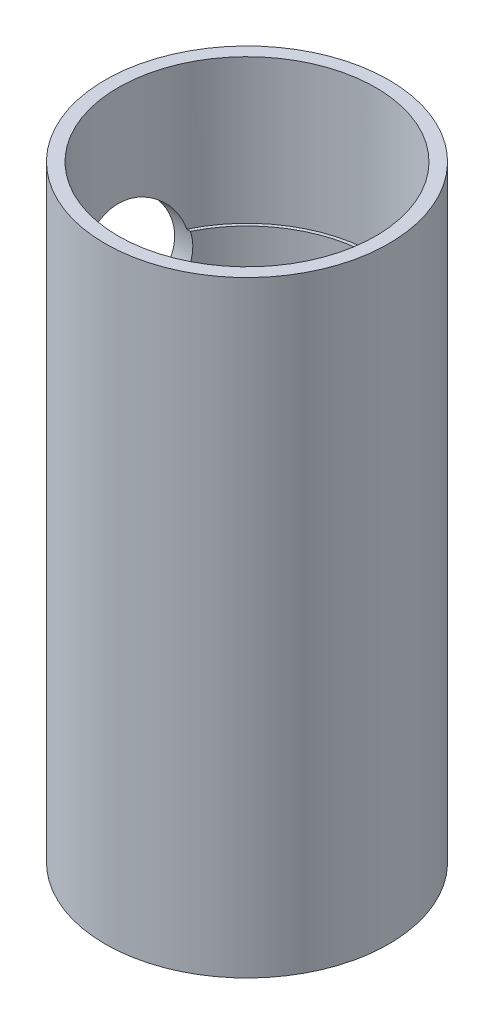
ISO-10303-21;
HEADER;
FILE_DESCRIPTION(('STEP AP214'),'2;1');
FILE_NAME('part.step','',(''),(''),'','','');
FILE_SCHEMA(('AUTOMOTIVE_DESIGN { 1 0 10303 214 1 1 1 1 }'));
ENDSEC;
DATA;
#1=APPLICATION_CONTEXT('core data for automotive mechanical design processes');
#2=APPLICATION_PROTOCOL_DEFINITION('international standard','automotive_design',2000,#1);
#3=PRODUCT_CONTEXT('',#1,'mechanical');
#4=PRODUCT('Part','Part','',(#3));
#5=PRODUCT_RELATED_PRODUCT_CATEGORY('part','',(#4));
#6=PRODUCT_DEFINITION_FORMATION('','',#4);
#7=PRODUCT_DEFINITION_CONTEXT('part definition',#1,'design');
#8=PRODUCT_DEFINITION('design','',#6,#7);
#9=PRODUCT_DEFINITION_SHAPE('','',#8);
#10=(LENGTH_UNIT() NAMED_UNIT(*) SI_UNIT(.MILLI.,.METRE.));
#11=(NAMED_UNIT(*) PLANE_ANGLE_UNIT() SI_UNIT($,.RADIAN.));
#12=(NAMED_UNIT(*) SI_UNIT($,.STERADIAN.) SOLID_ANGLE_UNIT());
#13=UNCERTAINTY_MEASURE_WITH_UNIT(LENGTH_MEASURE(1.E-05),#10,'distance_accuracy_value','');
#14=(GEOMETRIC_REPRESENTATION_CONTEXT(3) GLOBAL_UNCERTAINTY_ASSIGNED_CONTEXT((#13)) GLOBAL_UNIT_ASSIGNED_CONTEXT((#10,
#11,#12)) REPRESENTATION_CONTEXT('',''));
#15=CARTESIAN_POINT('',(0.,0.,0.));
#16=DIRECTION('',(0.,0.,1.));
#17=DIRECTION('',(1.,0.,0.));
#18=AXIS2_PLACEMENT_3D('',#15,#16,#17);
#19=CARTESIAN_POINT('',(0.,92.5,0.));
#20=DIRECTION('',(0.,-1.,0.));
#21=DIRECTION('',(0.,0.,-1.));
#22=AXIS2_PLACEMENT_3D('',#19,#20,#21);
#23=CYLINDRICAL_SURFACE('',#22,38.25);
#24=CARTESIAN_POINT('',(-34.2641941390718,48.5,17.0008088042893));
#25=CARTESIAN_POINT('',(-34.2381435848934,48.2849354779542,17.053307658475));
#26=CARTESIAN_POINT('',(-34.2139501900393,48.0686850927902,17.1017703815142));
#27=CARTESIAN_POINT('',(-34.1694481465527,47.6341120665675,17.1905149308626));
#28=CARTESIAN_POINT('',(-34.1491395748714,47.4157893845503,17.2307965951209));
#29=CARTESIAN_POINT('',(-34.0943033376247,46.7582367167698,17.3391939806238));
#30=CARTESIAN_POINT('',(-34.0658577161328,46.3163613613227,17.3948769432476));
#31=CARTESIAN_POINT('',(-34.0262278013022,45.4302944303113,17.4722693404018));
#32=CARTESIAN_POINT('',(-34.014990750002,44.9861141401189,17.4940826153484));
#33=CARTESIAN_POINT('',(-34.0099826794918,44.0973048101313,17.5038171775729));
#34=CARTESIAN_POINT('',(-34.016210190714,43.6526758112401,17.4917413164754));
#35=CARTESIAN_POINT('',(-34.0459345779966,42.765756573535,17.4338145053133));
#36=CARTESIAN_POINT('',(-34.0694491962198,42.3234692080585,17.3879288553609));
#37=CARTESIAN_POINT('',(-34.1329835449892,41.4448138791733,17.2628744296219));
#38=CARTESIAN_POINT('',(-34.1730042889734,41.0084462809243,17.1837036101966));
#39=CARTESIAN_POINT('',(-34.2682698028966,40.1445013582464,16.9929258414245));
#40=CARTESIAN_POINT('',(-34.3235170488628,39.7169254756272,16.8813136165217));
#41=CARTESIAN_POINT('',(-34.4475435978451,38.8732385977085,16.6267632834821));
#42=CARTESIAN_POINT('',(-34.5163230406553,38.4571277208988,16.4838248517285));
#43=CARTESIAN_POINT('',(-34.6667363889519,37.6315376158535,16.1651306656347));
#44=CARTESIAN_POINT('',(-34.7485727210965,37.2222989186612,15.9888482766277));
#45=CARTESIAN_POINT('',(-34.9219725410941,36.4199828887646,15.6064856014758));
#46=CARTESIAN_POINT('',(-35.0135392965897,36.0269110470224,15.4003952968805));
#47=CARTESIAN_POINT('',(-35.2040516835182,35.2587246783528,14.9597746127656));
#48=CARTESIAN_POINT('',(-35.3030001278675,34.8836170873327,14.7252333700046));
#49=CARTESIAN_POINT('',(-35.5058567589881,34.1531122381153,14.2291408484609));
#50=CARTESIAN_POINT('',(-35.6097652864978,33.7977163376698,13.9675877126269));
#51=CARTESIAN_POINT('',(-35.8311275063851,33.0722049803065,13.3902222747479));
#52=CARTESIAN_POINT('',(-35.9488648585861,32.7044111751399,13.0715960042441));
#53=CARTESIAN_POINT('',(-36.1843046752592,31.9967524573306,12.4049785893923));
#54=CARTESIAN_POINT('',(-36.3020071366213,31.6568773143975,12.0569982968926));
#55=CARTESIAN_POINT('',(-36.5344607320918,31.00658966723,11.3331480999331));
#56=CARTESIAN_POINT('',(-36.6492098810396,30.6961966217081,10.9572600634305));
#57=CARTESIAN_POINT('',(-36.8726927520938,30.1072056144364,10.179907041982));
#58=CARTESIAN_POINT('',(-36.9814288725541,29.8285949281678,9.77845239401758));
#59=CARTESIAN_POINT('',(-37.1938647235533,29.2956674646876,8.9372107724763));
#60=CARTESIAN_POINT('',(-37.2972460232827,29.042573234301,8.49656694811337));
#61=CARTESIAN_POINT('',(-37.4916875416269,28.5747212242354,7.59272813345202));
#62=CARTESIAN_POINT('',(-37.5827473129546,28.3599648361779,7.12953232531777));
#63=CARTESIAN_POINT('',(-37.7498444293093,27.9710781432407,6.18401797061164));
#64=CARTESIAN_POINT('',(-37.8258891329526,27.7969279303925,5.70170893094741));
#65=CARTESIAN_POINT('',(-37.9607035929183,27.4911335297655,4.72145580067361));
#66=CARTESIAN_POINT('',(-38.0194749640292,27.3594853685916,4.22351317638151));
#67=CARTESIAN_POINT('',(-38.1143676489956,27.1482341474891,3.25240313375543));
#68=CARTESIAN_POINT('',(-38.1518140468948,27.0655687515312,2.78002976803506));
#69=CARTESIAN_POINT('',(-38.2092129443408,26.9392378759796,1.82904354982571));
#70=CARTESIAN_POINT('',(-38.2291662712299,26.8955705519537,1.3504309935086));
#71=CARTESIAN_POINT('',(-38.2510106768318,26.8477782069746,0.39098625475133));
#72=CARTESIAN_POINT('',(-38.2529078172102,26.8436399156774,-0.0898451285645744));
#73=CARTESIAN_POINT('',(-38.2386008057896,26.8749237012639,-1.0499393157405));
#74=CARTESIAN_POINT('',(-38.2223972591985,26.910344455466,-1.52920217150788));
#75=CARTESIAN_POINT('',(-38.1739532384048,27.0167870428658,-2.45182127379952));
#76=CARTESIAN_POINT('',(-38.1428025818588,27.0853917843811,-2.89551656590489));
#77=CARTESIAN_POINT('',(-38.0658137103129,27.2561566037183,-3.77507582412566));
#78=CARTESIAN_POINT('',(-38.0199762702756,27.3583149110602,-4.21094020216573));
#79=CARTESIAN_POINT('',(-37.9147055894478,27.5951903216102,-5.07205990229719));
#80=CARTESIAN_POINT('',(-37.8552714777882,27.7299095103793,-5.49731454289734));
#81=CARTESIAN_POINT('',(-37.724187426682,28.0306823545084,-6.33465028591056));
#82=CARTESIAN_POINT('',(-37.65253701193,28.1967372290869,-6.74673087501375));
#83=CARTESIAN_POINT('',(-37.4963864340642,28.5640906181402,-7.56722906376009));
#84=CARTESIAN_POINT('',(-37.4115726593048,28.7662751614723,-7.97518997425803));
#85=CARTESIAN_POINT('',(-37.2326667858936,29.200803038743,-8.77257159703507));
#86=CARTESIAN_POINT('',(-37.1385745884722,29.4331466937363,-9.1619921118847));
#87=CARTESIAN_POINT('',(-36.9432040768317,29.9264386839699,-9.920462389794));
#88=CARTESIAN_POINT('',(-36.8419244682634,30.1873921760634,-10.2895084623263));
#89=CARTESIAN_POINT('',(-36.6343879472974,30.7363862271596,-11.0055969343031));
#90=CARTESIAN_POINT('',(-36.5281291107501,31.0244373016776,-11.3526307034381));
#91=CARTESIAN_POINT('',(-36.3038844379294,31.6514822562194,-12.0514007554351));
#92=CARTESIAN_POINT('',(-36.185667327808,31.9927243815419,-12.4010483415857));
#93=CARTESIAN_POINT('',(-35.9492358333471,32.7032290000104,-13.0706172093886));
#94=CARTESIAN_POINT('',(-35.8310214491907,33.0724923188239,-13.3905376144867));
#95=CARTESIAN_POINT('',(-35.5977296042384,33.8372236754821,-13.9989407114712));
#96=CARTESIAN_POINT('',(-35.4826531892806,34.2327003027419,-14.2874130159301));
#97=CARTESIAN_POINT('',(-35.2589048929774,35.047772414233,-14.8309997173997));
#98=CARTESIAN_POINT('',(-35.1502339838505,35.4673715407497,-15.0861090577515));
#99=CARTESIAN_POINT('',(-34.9393673629489,36.3417321055678,-15.5683824467248));
#100=CARTESIAN_POINT('',(-34.8374756303952,36.7971795166681,-15.7944389557166));
#101=CARTESIAN_POINT('',(-34.6475454313125,37.7282604543039,-16.2068398948384));
#102=CARTESIAN_POINT('',(-34.5595003893526,38.2038842625157,-16.3932031892248));
#103=CARTESIAN_POINT('',(-34.4005134627231,39.1720921357527,-16.7242618329952));
#104=CARTESIAN_POINT('',(-34.3295671598624,39.6646717818354,-16.8689679481781));
#105=CARTESIAN_POINT('',(-34.2076240679525,40.6629581013979,-17.1149020294832));
#106=CARTESIAN_POINT('',(-34.1566241234102,41.1686626850171,-17.2161368729638));
#107=CARTESIAN_POINT('',(-34.0801897971872,42.1448103002928,-17.3669123065925));
#108=CARTESIAN_POINT('',(-34.0529327501744,42.6145418657875,-17.4201523652447));
#109=CARTESIAN_POINT('',(-34.0179144579244,43.5575658098823,-17.4884391329691));
#110=CARTESIAN_POINT('',(-34.010154879679,44.0308584894805,-17.5034825763138));
#111=CARTESIAN_POINT('',(-34.0144311694162,44.9762367631149,-17.495170153445));
#112=CARTESIAN_POINT('',(-34.0264355124444,45.4483230788278,-17.4718754395241));
#113=CARTESIAN_POINT('',(-34.0697198385377,46.3879762786799,-17.3873217187934));
#114=CARTESIAN_POINT('',(-34.100988510702,46.8555456514072,-17.3260849892227));
#115=CARTESIAN_POINT('',(-34.1585584494719,47.5176350763709,-17.2121116657303));
#116=CARTESIAN_POINT('',(-34.1774908392059,47.7155312439865,-17.1745079542443));
#117=CARTESIAN_POINT('',(-34.2185092300184,48.1092723068575,-17.0926362884327));
#118=CARTESIAN_POINT('',(-34.2405900559208,48.3051200131082,-17.0483792639901));
#119=CARTESIAN_POINT('',(-34.2641941390718,48.5,-17.0008088042893));
#120=B_SPLINE_CURVE_WITH_KNOTS('',3,(#24,#25,#26,#27,#28,#29,#30,#31,#32,#33,#34,#35,#36,#37,
#38,#39,#40,#41,#42,#43,#44,#45,#46,#47,#48,#49,#50,#51,#52,#53,#54,#55,#56,#57,#58,#59,#60,#61,
#62,#63,#64,#65,#66,#67,#68,#69,#70,#71,#72,#73,#74,#75,#76,#77,#78,#79,#80,#81,#82,#83,#84,#85,
#86,#87,#88,#89,#90,#91,#92,#93,#94,#95,#96,#97,#98,#99,#100,#101,#102,#103,#104,#105,#106,#107,
#108,#109,#110,#111,#112,#113,#114,#115,#116,#117,#118,#119),.UNSPECIFIED.,.F.,.F.,(4,2,2,2,2,2,
2,2,2,2,2,2,2,2,2,2,2,2,2,2,2,2,2,2,2,2,2,2,2,2,2,2,2,2,2,2,2,2,2,2,2,2,2,2,2,2,2,4),(0.,
0.668624185006783,1.33726161285922,2.67434813861644,4.00732716524454,5.34019403079537,
6.67443076194051,8.00874942435118,9.34328519247991,10.6778347477381,12.0355522387374,
13.3937271240389,14.7524222346864,16.11121081706,17.6115088712097,19.1112546927625,
20.6119835934538,22.1121095314822,23.6657956600238,25.2195381742038,26.7725173265876,
28.3253512533266,29.7664959521713,31.207572487785,32.6481652206734,34.0887097878787,
35.4372914295982,36.7858019237924,38.1343988145036,39.483048187664,40.8709989422968,
42.2589644733725,43.6471805944283,45.0359376679571,46.5422543513417,48.0486154368329,
49.5554725811596,51.0625578483159,52.6162275358085,54.1691571838055,55.7216851347007,
57.2739673778463,58.692640322139,60.1114345557986,61.5279678967541,62.943670322774,
63.550528057953,64.1563995427988),.UNSPECIFIED.);
#121=CARTESIAN_POINT('',(-34.2641941390718,48.5,17.0008088042893));
#122=VERTEX_POINT('',#121);
#123=CARTESIAN_POINT('',(-34.2641941390718,48.5,-17.0008088042893));
#124=VERTEX_POINT('',#123);
#125=EDGE_CURVE('E54',#122,#124,#120,.T.);
#126=ORIENTED_EDGE('',*,*,#125,.F.);
#127=CARTESIAN_POINT('',(0.,48.5,0.));
#128=DIRECTION('',(0.,1.,0.));
#129=DIRECTION('',(0.,0.,1.));
#130=AXIS2_PLACEMENT_3D('',#127,#128,#129);
#131=CIRCLE('',#130,38.25);
#132=EDGE_CURVE('E85',#122,#124,#131,.T.);
#133=ORIENTED_EDGE('',*,*,#132,.T.);
#134=EDGE_LOOP('',(#126,#133));
#135=FACE_BOUND('',#134,.T.);
#136=CARTESIAN_POINT('',(0.,13.85,0.));
#137=DIRECTION('',(0.,-1.,0.));
#138=DIRECTION('',(0.,0.,-1.));
#139=AXIS2_PLACEMENT_3D('',#136,#137,#138);
#140=CIRCLE('',#139,38.25);
#141=CARTESIAN_POINT('',(0.,13.85,-38.25));
#142=VERTEX_POINT('',#141);
#143=EDGE_CURVE('E91',#142,#142,#140,.T.);
#144=ORIENTED_EDGE('',*,*,#143,.T.);
#145=EDGE_LOOP('',(#144));
#146=FACE_BOUND('',#145,.T.);
#147=ADVANCED_FACE('F39',(#135,#146),#23,.F.);
#148=CARTESIAN_POINT('',(0.,92.5,0.));
#149=DIRECTION('',(0.,1.,0.));
#150=DIRECTION('',(0.,0.,1.));
#151=AXIS2_PLACEMENT_3D('',#148,#149,#150);
#152=PLANE('',#151);
#153=CARTESIAN_POINT('',(0.,92.5,0.));
#154=DIRECTION('',(0.,1.,0.));
#155=DIRECTION('',(0.,0.,1.));
#156=AXIS2_PLACEMENT_3D('',#153,#154,#155);
#157=CIRCLE('',#156,39.25);
#158=CARTESIAN_POINT('',(0.,92.5,39.25));
#159=VERTEX_POINT('',#158);
#160=EDGE_CURVE('E79',#159,#159,#157,.T.);
#161=ORIENTED_EDGE('',*,*,#160,.F.);
#162=EDGE_LOOP('',(#161));
#163=FACE_BOUND('',#162,.T.);
#164=CARTESIAN_POINT('',(0.,92.5,0.));
#165=DIRECTION('',(0.,1.,0.));
#166=DIRECTION('',(0.,0.,1.));
#167=AXIS2_PLACEMENT_3D('',#164,#165,#166);
#168=CIRCLE('',#167,43.25);
#169=CARTESIAN_POINT('',(0.,92.5,43.25));
#170=VERTEX_POINT('',#169);
#171=EDGE_CURVE('E99',#170,#170,#168,.T.);
#172=ORIENTED_EDGE('',*,*,#171,.T.);
#173=EDGE_LOOP('',(#172));
#174=FACE_BOUND('',#173,.T.);
#175=ADVANCED_FACE('F118',(#163,#174),#152,.T.);
#176=CARTESIAN_POINT('',(0.,-92.5,0.));
#177=DIRECTION('',(0.,1.,0.));
#178=DIRECTION('',(0.,0.,1.));
#179=AXIS2_PLACEMENT_3D('',#176,#177,#178);
#180=PLANE('',#179);
#181=CARTESIAN_POINT('',(0.,-92.5,0.));
#182=DIRECTION('',(0.,1.,0.));
#183=DIRECTION('',(0.,0.,1.));
#184=AXIS2_PLACEMENT_3D('',#181,#182,#183);
#185=CIRCLE('',#184,43.25);
#186=CARTESIAN_POINT('',(0.,-92.5,43.25));
#187=VERTEX_POINT('',#186);
#188=EDGE_CURVE('E98',#187,#187,#185,.T.);
#189=ORIENTED_EDGE('',*,*,#188,.F.);
#190=EDGE_LOOP('',(#189));
#191=FACE_BOUND('',#190,.T.);
#192=CARTESIAN_POINT('',(0.,-92.5,0.));
#193=DIRECTION('',(0.,1.,0.));
#194=DIRECTION('',(0.,0.,1.));
#195=AXIS2_PLACEMENT_3D('',#192,#193,#194);
#196=CIRCLE('',#195,38.25);
#197=CARTESIAN_POINT('',(0.,-92.5,38.25));
#198=VERTEX_POINT('',#197);
#199=EDGE_CURVE('E95',#198,#198,#196,.T.);
#200=ORIENTED_EDGE('',*,*,#199,.T.);
#201=EDGE_LOOP('',(#200));
#202=FACE_BOUND('',#201,.T.);
#203=ADVANCED_FACE('F116',(#191,#202),#180,.F.);
#204=CARTESIAN_POINT('',(0.,92.5,0.));
#205=DIRECTION('',(0.,-1.,0.));
#206=DIRECTION('',(0.,0.,-1.));
#207=AXIS2_PLACEMENT_3D('',#204,#205,#206);
#208=CYLINDRICAL_SURFACE('',#207,43.25);
#209=CARTESIAN_POINT('',(-43.25,26.85,0.));
#210=CARTESIAN_POINT('',(-43.2499977648821,26.850002844216,-0.470059434277367));
#211=CARTESIAN_POINT('',(-43.242315552243,26.8689650815116,-0.940294062765784));
#212=CARTESIAN_POINT('',(-43.211778779537,26.9446417731731,-1.87743082592684));
#213=CARTESIAN_POINT('',(-43.1889142317585,27.0013810792808,-2.34433056223458));
#214=CARTESIAN_POINT('',(-43.1285451481035,27.1522183293541,-3.27227048018818));
#215=CARTESIAN_POINT('',(-43.0910054421133,27.24640603052,-3.73329381704013));
#216=CARTESIAN_POINT('',(-43.0022881934933,27.4711689672634,-4.64493934781961));
#217=CARTESIAN_POINT('',(-42.9511128541476,27.6017383243465,-5.09556320935262));
#218=CARTESIAN_POINT('',(-42.8366335919219,27.8975472167294,-5.98200699968892));
#219=CARTESIAN_POINT('',(-42.7733701371742,28.062671242022,-6.41787076643722));
#220=CARTESIAN_POINT('',(-42.6361865097981,28.4264242902271,-7.27364607323425));
#221=CARTESIAN_POINT('',(-42.5622659373908,28.6250545701019,-7.69355701410011));
#222=CARTESIAN_POINT('',(-42.4056182956549,29.0541241803067,-8.51473250296929));
#223=CARTESIAN_POINT('',(-42.3228965934096,29.28454414988,-8.91600820300398));
#224=CARTESIAN_POINT('',(-42.1505457868008,29.7757448603038,-9.69816737601018));
#225=CARTESIAN_POINT('',(-42.0609139936476,30.0365374398211,-10.0790428123304));
#226=CARTESIAN_POINT('',(-41.8728593952449,30.5987437432511,-10.8343968901387));
#227=CARTESIAN_POINT('',(-41.7742237278819,30.9014320696689,-11.2078742027632));
#228=CARTESIAN_POINT('',(-41.5742488793874,31.536087355285,-11.9282904328624));
#229=CARTESIAN_POINT('',(-41.4729096040497,31.8680553356549,-12.2752284239501));
#230=CARTESIAN_POINT('',(-41.2700801175748,32.5594839715228,-12.9407913246801));
#231=CARTESIAN_POINT('',(-41.1685898622032,32.9189556000249,-13.2594048230751));
#232=CARTESIAN_POINT('',(-40.9681385478603,33.6633556892427,-13.8663734349416));
#233=CARTESIAN_POINT('',(-40.8691778925874,34.0482881785177,-14.1547237412418));
#234=CARTESIAN_POINT('',(-40.6720426858552,34.8597699571218,-14.7118577265007));
#235=CARTESIAN_POINT('',(-40.5741141137364,35.2874193633521,-14.9791292444083));
#236=CARTESIAN_POINT('',(-40.3870626977385,36.1654895559165,-15.4763768145114));
#237=CARTESIAN_POINT('',(-40.2979362310091,36.6159008573367,-15.7063682359944));
#238=CARTESIAN_POINT('',(-40.1313921632747,37.5366984820836,-16.1271539384876));
#239=CARTESIAN_POINT('',(-40.0539727271687,38.0070816599415,-16.3179543644506));
#240=CARTESIAN_POINT('',(-39.9135461941763,38.9645730845136,-16.6584905254094));
#241=CARTESIAN_POINT('',(-39.85053809301,39.4516801630702,-16.8082291220181));
#242=CARTESIAN_POINT('',(-39.7437927605097,40.4161051724473,-17.05904913232));
#243=CARTESIAN_POINT('',(-39.6993009203272,40.8928388462224,-17.1620557454882));
#244=CARTESIAN_POINT('',(-39.627140145584,41.8544935024117,-17.328026130822));
#245=CARTESIAN_POINT('',(-39.5994707170832,42.3394142440074,-17.3909910786943));
#246=CARTESIAN_POINT('',(-39.5619841425426,43.3133024504649,-17.4761003471459));
#247=CARTESIAN_POINT('',(-39.5521592079475,43.8022680562117,-17.4982624769182));
#248=CARTESIAN_POINT('',(-39.550709122454,44.7803520513256,-17.5015406934382));
#249=CARTESIAN_POINT('',(-39.5590830936164,45.2694704321846,-17.4826587602059));
#250=CARTESIAN_POINT('',(-39.5924666556732,46.2088429713542,-17.4069126294781));
#251=CARTESIAN_POINT('',(-39.616241887769,46.6593717558863,-17.3528654886494));
#252=CARTESIAN_POINT('',(-39.678434872842,47.5538634614433,-17.2101817936726));
#253=CARTESIAN_POINT('',(-39.7168518193313,47.9978267427071,-17.1215471446506));
#254=CARTESIAN_POINT('',(-39.8071474899506,48.8763072272052,-16.9105484982901));
#255=CARTESIAN_POINT('',(-39.8590279445647,49.310823208378,-16.7881801649869));
#256=CARTESIAN_POINT('',(-39.9747128613793,50.167681839503,-16.5108262606456));
#257=CARTESIAN_POINT('',(-40.0385177674413,50.5900240356373,-16.3558394754305));
#258=CARTESIAN_POINT('',(-40.1776757417442,51.4286761037803,-16.0110002279462));
#259=CARTESIAN_POINT('',(-40.2532396700456,51.8446823687218,-15.8204951618841));
#260=CARTESIAN_POINT('',(-40.4128218147288,52.6592245996199,-15.4082820241698));
#261=CARTESIAN_POINT('',(-40.4968400696483,53.0577604859284,-15.1865738102807));
#262=CARTESIAN_POINT('',(-40.6711533374526,53.8354567600271,-14.7133734515888));
#263=CARTESIAN_POINT('',(-40.7614502571728,54.21461120046,-14.4618722421681));
#264=CARTESIAN_POINT('',(-40.9460462107693,54.9515799217684,-13.9306447464836));
#265=CARTESIAN_POINT('',(-41.0403454563368,55.3093930714467,-13.6509169661793));
#266=CARTESIAN_POINT('',(-41.2382629032203,56.02951364981,-13.0414265505587));
#267=CARTESIAN_POINT('',(-41.3420256165126,56.3899136734192,-12.7094537521764));
#268=CARTESIAN_POINT('',(-41.5487311593366,57.0815933228605,-12.016492967026));
#269=CARTESIAN_POINT('',(-41.6516742955086,57.4128843550012,-11.6555164524246));
#270=CARTESIAN_POINT('',(-41.8540982974705,58.0446203183379,-10.9063084669352));
#271=CARTESIAN_POINT('',(-41.9535776316081,58.3450517154518,-10.5180651622934));
#272=CARTESIAN_POINT('',(-42.1463937721416,58.9128752070573,-9.71667748219642));
#273=CARTESIAN_POINT('',(-42.2397306070256,59.1802674547862,-9.30353322224621));
#274=CARTESIAN_POINT('',(-42.4196180657154,59.6851985955382,-8.44596708696947));
#275=CARTESIAN_POINT('',(-42.5059878411286,59.9220034894991,-8.00107428827261));
#276=CARTESIAN_POINT('',(-42.6672815337763,60.3570372814059,-7.09078391371716));
#277=CARTESIAN_POINT('',(-42.7422051840391,60.5552652796069,-6.62538585991634));
#278=CARTESIAN_POINT('',(-42.8783924764108,60.9111312833959,-5.67759167941601));
#279=CARTESIAN_POINT('',(-42.9396618574823,61.0687863463359,-5.19520279315624));
#280=CARTESIAN_POINT('',(-43.0467397188671,61.3419130834324,-4.21695657454257));
#281=CARTESIAN_POINT('',(-43.0925492978836,61.4573877553292,-3.72110020200849));
#282=CARTESIAN_POINT('',(-43.1650481182577,61.6391693672073,-2.75020559605458));
#283=CARTESIAN_POINT('',(-43.1927242964743,61.7080226662511,-2.27571658022923));
#284=CARTESIAN_POINT('',(-43.2324232768283,61.8065738855666,-1.32204201876229));
#285=CARTESIAN_POINT('',(-43.2444467080269,61.8362733793736,-0.842856662639644));
#286=CARTESIAN_POINT('',(-43.2525023411747,61.8561857342567,0.116354639928129));
#287=CARTESIAN_POINT('',(-43.2485382470592,61.8464077413418,0.596380365922489));
#288=CARTESIAN_POINT('',(-43.2247382862753,61.7874949093837,1.55360698058765));
#289=CARTESIAN_POINT('',(-43.2049027368322,61.7383608569562,2.03080792552574));
#290=CARTESIAN_POINT('',(-43.1511908786069,61.6044582525519,2.95673378052892));
#291=CARTESIAN_POINT('',(-43.118007041868,61.5214445609101,3.40575429504912));
#292=CARTESIAN_POINT('',(-43.0385434003731,61.3209218495559,4.2948181443191));
#293=CARTESIAN_POINT('',(-42.9922641023187,61.2034141645105,4.73486182570271));
#294=CARTESIAN_POINT('',(-42.8877377037914,60.9349576580756,5.6031887580431));
#295=CARTESIAN_POINT('',(-42.8294896795458,60.7840062553564,6.03147109833955));
#296=CARTESIAN_POINT('',(-42.7024178840039,60.4499331227533,6.87367471807431));
#297=CARTESIAN_POINT('',(-42.6335937380661,60.266810253216,7.28759548814101));
#298=CARTESIAN_POINT('',(-42.4847181864237,59.8637013041062,8.11120757133793));
#299=CARTESIAN_POINT('',(-42.4043868747247,59.6427557671346,8.52037852079318));
#300=CARTESIAN_POINT('',(-42.2361292412104,59.1698158329657,9.3187086651997));
#301=CARTESIAN_POINT('',(-42.148202815797,58.9178210122328,9.70786758706921));
#302=CARTESIAN_POINT('',(-41.9668230084931,58.3844091352346,10.4642029711473));
#303=CARTESIAN_POINT('',(-41.8733686332185,58.1029867837612,10.8313754583454));
#304=CARTESIAN_POINT('',(-41.6831115687275,57.5123505490372,11.5419259587758));
#305=CARTESIAN_POINT('',(-41.5863076915489,57.2031267420319,11.885295397412));
#306=CARTESIAN_POINT('',(-41.3850974807288,56.5369312254383,12.5686708075017));
#307=CARTESIAN_POINT('',(-41.2806185295181,56.1781460020152,12.9068899517914));
#308=CARTESIAN_POINT('',(-41.073325245266,55.4330315158436,13.5520961351205));
#309=CARTESIAN_POINT('',(-40.9705110141142,55.0467005749155,13.8590812685067));
#310=CARTESIAN_POINT('',(-40.7694070429601,54.2485465391662,14.4399610535917));
#311=CARTESIAN_POINT('',(-40.6711190897773,53.8367135248977,14.7138427053217));
#312=CARTESIAN_POINT('',(-40.4820456971393,52.9902320251574,15.2263283875827));
#313=CARTESIAN_POINT('',(-40.3912572575834,52.5555927779774,15.4649465553332));
#314=CARTESIAN_POINT('',(-40.2190041915652,51.6609878143109,15.9075853310841));
#315=CARTESIAN_POINT('',(-40.1376551394433,51.2007932934099,16.1111893612872));
#316=CARTESIAN_POINT('',(-39.9882194615447,50.2626615901637,16.4785976805825));
#317=CARTESIAN_POINT('',(-39.9201330310867,49.7847241466418,16.6424013835439));
#318=CARTESIAN_POINT('',(-39.7997082344541,48.8149269365687,16.9283732359771));
#319=CARTESIAN_POINT('',(-39.7473598526283,48.3230762433826,17.0505678719415));
#320=CARTESIAN_POINT('',(-39.6603421243688,47.3291272372655,17.2520102640288));
#321=CARTESIAN_POINT('',(-39.6256712486793,46.8270298146743,17.3312617351412));
#322=CARTESIAN_POINT('',(-39.577215905536,45.8540117934851,17.4416112219965));
#323=CARTESIAN_POINT('',(-39.5620849711273,45.3835084238347,17.475817182458));
#324=CARTESIAN_POINT('',(-39.5486894074129,44.4410460469657,17.5061121131864));
#325=CARTESIAN_POINT('',(-39.5504239169474,43.9690871152992,17.5022030296309));
#326=CARTESIAN_POINT('',(-39.5706969814816,43.0274539859396,17.4563185034596));
#327=CARTESIAN_POINT('',(-39.5892334693502,42.5577795143379,17.4143477435348));
#328=CARTESIAN_POINT('',(-39.6424648284504,41.6242546690589,17.2928270893453));
#329=CARTESIAN_POINT('',(-39.6771596111532,41.1604042634868,17.2132774009697));
#330=CARTESIAN_POINT('',(-39.7597804030315,40.2610112499345,17.0215379900631));
#331=CARTESIAN_POINT('',(-39.8070973271153,39.8250928841698,16.9108404084966));
#332=CARTESIAN_POINT('',(-39.9140832510825,38.9644766117882,16.65675359561));
#333=CARTESIAN_POINT('',(-39.9737518001177,38.5397782962648,16.5133655575087));
#334=CARTESIAN_POINT('',(-40.1037522229892,37.704032465471,16.1950943522642));
#335=CARTESIAN_POINT('',(-40.1740846169956,37.2929856172964,16.0202096486718));
#336=CARTESIAN_POINT('',(-40.3235447841811,36.4866142793651,15.6402019215587));
#337=CARTESIAN_POINT('',(-40.4026757526318,36.0912955726383,15.4350679038814));
#338=CARTESIAN_POINT('',(-40.5724797337683,35.2960996129921,14.9832551308622));
#339=CARTESIAN_POINT('',(-40.6635557748369,34.897284097535,14.7348584529602));
#340=CARTESIAN_POINT('',(-40.8508124733559,34.1217039644758,14.207459510504));
#341=CARTESIAN_POINT('',(-40.9469932982221,33.7449400709286,13.92845624186));
#342=CARTESIAN_POINT('',(-41.1420170461912,33.0152418045547,13.3413875548945));
#343=CARTESIAN_POINT('',(-41.2408610872391,32.6623176640744,13.033309791695));
#344=CARTESIAN_POINT('',(-41.4386748481155,31.9824196584947,12.389993249649));
#345=CARTESIAN_POINT('',(-41.5376445214441,31.6554380539841,12.0547626320578));
#346=CARTESIAN_POINT('',(-41.7399147344887,31.0080053623813,11.3353786570621));
#347=CARTESIAN_POINT('',(-41.8430588332582,30.689472782613,10.9494513062316));
#348=CARTESIAN_POINT('',(-42.0439434678828,30.0860011681566,10.1508056809915));
#349=CARTESIAN_POINT('',(-42.1416836810896,29.8010641382014,9.73808581007938));
#350=CARTESIAN_POINT('',(-42.3291039645086,29.2667917404913,8.8881332058247));
#351=CARTESIAN_POINT('',(-42.4187796894837,29.0174755235444,8.45088746124001));
#352=CARTESIAN_POINT('',(-42.5874802506419,28.5567436990427,7.55491682978529));
#353=CARTESIAN_POINT('',(-42.6665059739542,28.3453249342024,7.09619373624043));
#354=CARTESIAN_POINT('',(-42.8103192210252,27.9658242773945,6.16888932226306));
#355=CARTESIAN_POINT('',(-42.8753387708321,27.7970266103111,5.70063719331077));
#356=CARTESIAN_POINT('',(-42.9910694239837,27.4995296108421,4.74971895872984));
#357=CARTESIAN_POINT('',(-43.0417780744381,27.370837152102,4.26705039778131));
#358=CARTESIAN_POINT('',(-43.1272572015762,27.1553038258687,3.29253697619321));
#359=CARTESIAN_POINT('',(-43.1620725400378,27.068345121127,2.80072207409971));
#360=CARTESIAN_POINT('',(-43.2149135081823,26.9367889948241,1.81081580923629));
#361=CARTESIAN_POINT('',(-43.2329517425886,26.8921597704104,1.31272944388051));
#362=CARTESIAN_POINT('',(-43.2448956552269,26.8626187897994,0.678186142356621));
#363=CARTESIAN_POINT('',(-43.2468089024352,26.8578878531542,0.542603421824419));
#364=CARTESIAN_POINT('',(-43.2493613975927,26.8515780473008,0.271351999916106));
#365=CARTESIAN_POINT('',(-43.2500006451698,26.8499991790132,0.135683298514894));
#366=CARTESIAN_POINT('',(-43.25,26.85,0.));
#367=B_SPLINE_CURVE_WITH_KNOTS('',3,(#209,#210,#211,#212,#213,#214,#215,#216,#217,#218,#219,
#220,#221,#222,#223,#224,#225,#226,#227,#228,#229,#230,#231,#232,#233,#234,#235,#236,#237,#238,
#239,#240,#241,#242,#243,#244,#245,#246,#247,#248,#249,#250,#251,#252,#253,#254,#255,#256,#257,
#258,#259,#260,#261,#262,#263,#264,#265,#266,#267,#268,#269,#270,#271,#272,#273,#274,#275,#276,
#277,#278,#279,#280,#281,#282,#283,#284,#285,#286,#287,#288,#289,#290,#291,#292,#293,#294,#295,
#296,#297,#298,#299,#300,#301,#302,#303,#304,#305,#306,#307,#308,#309,#310,#311,#312,#313,#314,
#315,#316,#317,#318,#319,#320,#321,#322,#323,#324,#325,#326,#327,#328,#329,#330,#331,#332,#333,
#334,#335,#336,#337,#338,#339,#340,#341,#342,#343,#344,#345,#346,#347,#348,#349,#350,#351,#352,
#353,#354,#355,#356,#357,#358,#359,#360,#361,#362,#363,#364,#365,#366),.UNSPECIFIED.,.T.,.F.,(4,
2,2,2,2,2,2,2,2,2,2,2,2,2,2,2,2,2,2,2,2,2,2,2,2,2,2,2,2,2,2,2,2,2,2,2,2,2,2,2,2,2,2,2,2,2,2,2,2,
2,2,2,2,2,2,2,2,2,2,2,2,2,2,2,2,2,2,2,2,2,2,2,2,2,2,2,2,2,4),(0.,1.41003924077488,
2.82100699721751,4.23537718077374,5.64951896487065,7.0590069558035,8.46854783440609,
9.87723402424711,11.2864711425781,12.7570940385577,14.2277682449995,15.6990322902275,
17.1705296865129,18.7097780994274,20.2483903108289,21.7867610910347,23.3250246343991,
24.792359692957,26.2596516655098,27.7263030576375,29.1928836981261,30.5544309528382,
31.9159032222972,33.277550570484,34.6392486130907,36.0290043788645,37.4187664799242,
38.8089525120117,40.1992121656809,41.7000831713304,43.200363415752,44.7012988523331,
46.2022273272429,47.7342785464306,49.266365494007,50.7978072776178,52.3291402012052,
53.7680719896949,55.2069459478126,56.6454865716691,58.083998443916,59.4559195729871,
60.827787625669,62.1997616019336,63.5717841892957,64.9859465260284,66.400128155135,
67.8145646922908,69.2295081336958,70.7398268712683,72.2502377013995,73.7612397664135,
75.2716344139286,76.7989134437737,78.3262149641634,79.8525424464822,81.3787378659637,
82.7928916033446,84.2069731335422,85.6208807142639,87.0347805484984,88.3899828197027,
89.7451356332336,91.100354570842,92.4560672843107,93.8902891456858,95.3245580726885,
96.7594387463631,98.1938897311849,99.7248227455668,101.255847068483,102.787691442936,
104.319408138087,105.823373259555,107.327596004544,108.827546145633,110.326368454108,
110.733378090325,111.140387845417),.UNSPECIFIED.);
#368=CARTESIAN_POINT('',(-43.25,26.85,0.));
#369=VERTEX_POINT('',#368);
#370=EDGE_CURVE('E142',#369,#369,#367,.T.);
#371=ORIENTED_EDGE('',*,*,#370,.T.);
#372=EDGE_LOOP('',(#371));
#373=FACE_BOUND('',#372,.T.);
#374=ORIENTED_EDGE('',*,*,#171,.F.);
#375=EDGE_LOOP('',(#374));
#376=FACE_BOUND('',#375,.T.);
#377=ORIENTED_EDGE('',*,*,#188,.T.);
#378=EDGE_LOOP('',(#377));
#379=FACE_BOUND('',#378,.T.);
#380=ADVANCED_FACE('F41',(#373,#376,#379),#208,.T.);
#381=CARTESIAN_POINT('',(0.,-86.15,0.));
#382=DIRECTION('',(0.,-1.,0.));
#383=DIRECTION('',(0.,0.,-1.));
#384=AXIS2_PLACEMENT_3D('',#381,#382,#383);
#385=CIRCLE('',#384,38.25);
#386=CARTESIAN_POINT('',(0.,-86.15,-38.25));
#387=VERTEX_POINT('',#386);
#388=EDGE_CURVE('E70',#387,#387,#385,.T.);
#389=ORIENTED_EDGE('',*,*,#388,.F.);
#390=EDGE_LOOP('',(#389));
#391=FACE_BOUND('',#390,.T.);
#392=ORIENTED_EDGE('',*,*,#199,.F.);
#393=EDGE_LOOP('',(#392));
#394=FACE_BOUND('',#393,.T.);
#395=ADVANCED_FACE('F109',(#391,#394),#23,.F.);
#396=CARTESIAN_POINT('',(0.,13.85,0.));
#397=DIRECTION('',(0.,-1.,0.));
#398=DIRECTION('',(0.,0.,-1.));
#399=AXIS2_PLACEMENT_3D('',#396,#397,#398);
#400=PLANE('',#399);
#401=CARTESIAN_POINT('',(0.,13.85,0.));
#402=DIRECTION('',(0.,-1.,0.));
#403=DIRECTION('',(0.,0.,-1.));
#404=AXIS2_PLACEMENT_3D('',#401,#402,#403);
#405=CIRCLE('',#404,36.25);
#406=CARTESIAN_POINT('',(0.,13.85,-36.25));
#407=VERTEX_POINT('',#406);
#408=EDGE_CURVE('E82',#407,#407,#405,.T.);
#409=ORIENTED_EDGE('',*,*,#408,.T.);
#410=EDGE_LOOP('',(#409));
#411=FACE_BOUND('',#410,.T.);
#412=ORIENTED_EDGE('',*,*,#143,.F.);
#413=EDGE_LOOP('',(#412));
#414=FACE_BOUND('',#413,.T.);
#415=ADVANCED_FACE('F112',(#411,#414),#400,.F.);
#416=CARTESIAN_POINT('',(0.,-86.15,0.));
#417=DIRECTION('',(0.,-1.,0.));
#418=DIRECTION('',(0.,0.,-1.));
#419=AXIS2_PLACEMENT_3D('',#416,#417,#418);
#420=PLANE('',#419);
#421=CARTESIAN_POINT('',(0.,-86.15,0.));
#422=DIRECTION('',(0.,-1.,0.));
#423=DIRECTION('',(0.,0.,-1.));
#424=AXIS2_PLACEMENT_3D('',#421,#422,#423);
#425=CIRCLE('',#424,36.25);
#426=CARTESIAN_POINT('',(0.,-86.15,-36.25));
#427=VERTEX_POINT('',#426);
#428=EDGE_CURVE('E78',#427,#427,#425,.T.);
#429=ORIENTED_EDGE('',*,*,#428,.F.);
#430=EDGE_LOOP('',(#429));
#431=FACE_BOUND('',#430,.T.);
#432=ORIENTED_EDGE('',*,*,#388,.T.);
#433=EDGE_LOOP('',(#432));
#434=FACE_BOUND('',#433,.T.);
#435=ADVANCED_FACE('F107',(#431,#434),#420,.T.);
#436=CARTESIAN_POINT('',(0.,13.85,0.));
#437=DIRECTION('',(0.,-1.,0.));
#438=DIRECTION('',(0.,0.,-1.));
#439=AXIS2_PLACEMENT_3D('',#436,#437,#438);
#440=CYLINDRICAL_SURFACE('',#439,36.25);
#441=ORIENTED_EDGE('',*,*,#408,.F.);
#442=EDGE_LOOP('',(#441));
#443=FACE_BOUND('',#442,.T.);
#444=ORIENTED_EDGE('',*,*,#428,.T.);
#445=EDGE_LOOP('',(#444));
#446=FACE_BOUND('',#445,.T.);
#447=ADVANCED_FACE('F160',(#443,#446),#440,.F.);
#448=CARTESIAN_POINT('',(0.,48.5,0.));
#449=DIRECTION('',(0.,1.,0.));
#450=DIRECTION('',(0.,0.,1.));
#451=AXIS2_PLACEMENT_3D('',#448,#449,#450);
#452=CYLINDRICAL_SURFACE('',#451,39.25);
#453=CARTESIAN_POINT('',(0.,48.5,0.));
#454=DIRECTION('',(0.,1.,0.));
#455=DIRECTION('',(0.,0.,1.));
#456=AXIS2_PLACEMENT_3D('',#453,#454,#455);
#457=CIRCLE('',#456,39.25);
#458=CARTESIAN_POINT('',(-35.3770405771879,48.5,17.0008088042893));
#459=VERTEX_POINT('',#458);
#460=CARTESIAN_POINT('',(-35.3770405771879,48.5,-17.0008088042893));
#461=VERTEX_POINT('',#460);
#462=EDGE_CURVE('E75',#459,#461,#457,.T.);
#463=ORIENTED_EDGE('',*,*,#462,.F.);
#464=CARTESIAN_POINT('',(-35.3770405771879,48.5,17.0008088042893));
#465=CARTESIAN_POINT('',(-35.4051448154363,48.7396066617131,16.9423198544225));
#466=CARTESIAN_POINT('',(-35.4354788642185,48.9776912754359,16.8788334042754));
#467=CARTESIAN_POINT('',(-35.50031139671,49.450429814747,16.742047905614));
#468=CARTESIAN_POINT('',(-35.5348095363493,49.6850840219886,16.6687496677721));
#469=CARTESIAN_POINT('',(-35.6440539431954,50.3829906122646,16.4345258527946));
#470=CARTESIAN_POINT('',(-35.7245982257521,50.8405892526174,16.2591726659128));
#471=CARTESIAN_POINT('',(-35.8981151851715,51.736120618749,15.8723838532961));
#472=CARTESIAN_POINT('',(-35.9910521032843,52.1741052564262,15.6610515764027));
#473=CARTESIAN_POINT('',(-36.1866154008,53.0294000161558,15.2037230658565));
#474=CARTESIAN_POINT('',(-36.2892432380449,53.4467070131483,14.9577216140369));
#475=CARTESIAN_POINT('',(-36.500931511558,54.2574909576772,14.433441349801));
#476=CARTESIAN_POINT('',(-36.60997821915,54.6510153596998,14.155230276679));
#477=CARTESIAN_POINT('',(-36.831684929954,55.4131575965007,13.5679029138179));
#478=CARTESIAN_POINT('',(-36.944344787976,55.7817764302336,13.2587878648622));
#479=CARTESIAN_POINT('',(-37.1704270708151,56.4925614769012,12.6110902260716));
#480=CARTESIAN_POINT('',(-37.2838501109708,56.8347025936092,12.2724803109283));
#481=CARTESIAN_POINT('',(-37.5084583102947,57.4902734839412,11.5678343058112));
#482=CARTESIAN_POINT('',(-37.6196434690318,57.803703252032,11.2017982105518));
#483=CARTESIAN_POINT('',(-37.8421767201092,58.4142269800789,10.4260552245811));
#484=CARTESIAN_POINT('',(-37.9532785961813,58.709824109919,10.0150972334492));
#485=CARTESIAN_POINT('',(-38.1668752893493,59.265213508468,9.16750354021124));
#486=CARTESIAN_POINT('',(-38.2693698021329,59.5250045114629,8.73086693116726));
#487=CARTESIAN_POINT('',(-38.4628136558129,60.0064401231255,7.83482115754633));
#488=CARTESIAN_POINT('',(-38.5537678376633,60.2281007407553,7.37542165478379));
#489=CARTESIAN_POINT('',(-38.721532125454,60.631221148638,6.43681985849778));
#490=CARTESIAN_POINT('',(-38.7983431687883,60.8126836033494,5.95761887997706));
#491=CARTESIAN_POINT('',(-38.9324390649837,61.1262175445954,5.00486163313138));
#492=CARTESIAN_POINT('',(-38.9904450322978,61.2601388646893,4.53201574480019));
#493=CARTESIAN_POINT('',(-39.0898047971203,61.4879949082957,3.57505441518071));
#494=CARTESIAN_POINT('',(-39.1311590075838,61.5819306234344,3.09093925367973));
#495=CARTESIAN_POINT('',(-39.1959918009201,61.7286537920588,2.11554194759396));
#496=CARTESIAN_POINT('',(-39.2194783205728,61.7814595156245,1.62426308405868));
#497=CARTESIAN_POINT('',(-39.2479035385077,61.8453212667015,0.638475121784163));
#498=CARTESIAN_POINT('',(-39.2528433517475,61.8563798038956,0.143966219013068));
#499=CARTESIAN_POINT('',(-39.2443724336309,61.837375257756,-0.806181298018306));
#500=CARTESIAN_POINT('',(-39.2323375824297,61.8103954404662,-1.26189746460909));
#501=CARTESIAN_POINT('',(-39.1926458587383,61.7210275529563,-2.169133321601));
#502=CARTESIAN_POINT('',(-39.1649899161293,61.6586415903671,-2.62065326016618));
#503=CARTESIAN_POINT('',(-39.0947555648498,61.4991262230519,-3.5163034228597));
#504=CARTESIAN_POINT('',(-39.0521776260697,61.4019979123531,-3.96043387922001));
#505=CARTESIAN_POINT('',(-38.9531513950722,61.1739722685264,-4.83835264534472));
#506=CARTESIAN_POINT('',(-38.8967027660525,61.0430741154096,-5.27214070369873));
#507=CARTESIAN_POINT('',(-38.7712782407127,60.7486963670457,-6.12675074920361));
#508=CARTESIAN_POINT('',(-38.7022993340614,60.585208941482,-6.547569592093));
#509=CARTESIAN_POINT('',(-38.5534332237026,60.2270661731316,-7.37370143332653));
#510=CARTESIAN_POINT('',(-38.4735461222365,60.0324111224731,-7.77901457695852));
#511=CARTESIAN_POINT('',(-38.3046393040549,59.6133439558031,-8.57213959267247));
#512=CARTESIAN_POINT('',(-38.2156163521463,59.3889212901791,-8.95994519448571));
#513=CARTESIAN_POINT('',(-38.0304192949636,58.9118886969737,-9.71602996368468));
#514=CARTESIAN_POINT('',(-37.9342446948412,58.6592768182727,-10.0843077768465));
#515=CARTESIAN_POINT('',(-37.7294441155442,58.1075032849778,-10.8263823830142));
#516=CARTESIAN_POINT('',(-37.620424760356,57.8062735969417,-11.1985343822015));
#517=CARTESIAN_POINT('',(-37.399233760066,57.1748824757891,-11.9164139301425));
#518=CARTESIAN_POINT('',(-37.2870620238271,56.8447202056291,-12.262140713851));
#519=CARTESIAN_POINT('',(-37.0623927173843,56.1573665395478,-12.9253279928511));
#520=CARTESIAN_POINT('',(-36.9498952188549,55.8001807104977,-13.2427942806528));
#521=CARTESIAN_POINT('',(-36.7274267961783,55.0605453448593,-13.8478354777371));
#522=CARTESIAN_POINT('',(-36.6174561097399,54.6780934443859,-14.135407583634));
#523=CARTESIAN_POINT('',(-36.39243925098,53.8510818962499,-14.7056396721457));
#524=CARTESIAN_POINT('',(-36.2779563024776,53.4041122600426,-14.985039837527));
#525=CARTESIAN_POINT('',(-36.0595252608746,52.4848737144865,-15.5032982798971));
#526=CARTESIAN_POINT('',(-35.955576185711,52.0126071698309,-15.7421603376185));
#527=CARTESIAN_POINT('',(-35.7617127040844,51.0442562150113,-16.1777468577889));
#528=CARTESIAN_POINT('',(-35.6718434312758,50.5481016164692,-16.3743365345641));
#529=CARTESIAN_POINT('',(-35.5505729281271,49.7899588273507,-16.6351566563545));
#530=CARTESIAN_POINT('',(-35.5123901930806,49.5348025319053,-16.7164495716733));
#531=CARTESIAN_POINT('',(-35.4409352772102,49.0203684609185,-16.8674097166867));
#532=CARTESIAN_POINT('',(-35.4076636072493,48.7610902597078,-16.9370757370171));
#533=CARTESIAN_POINT('',(-35.3770405771879,48.5,-17.0008088042893));
#534=B_SPLINE_CURVE_WITH_KNOTS('',3,(#464,#465,#466,#467,#468,#469,#470,#471,#472,#473,#474,
#475,#476,#477,#478,#479,#480,#481,#482,#483,#484,#485,#486,#487,#488,#489,#490,#491,#492,#493,
#494,#495,#496,#497,#498,#499,#500,#501,#502,#503,#504,#505,#506,#507,#508,#509,#510,#511,#512,
#513,#514,#515,#516,#517,#518,#519,#520,#521,#522,#523,#524,#525,#526,#527,#528,#529,#530,#531,
#532,#533),.UNSPECIFIED.,.F.,.F.,(4,2,2,2,2,2,2,2,2,2,2,2,2,2,2,2,2,2,2,2,2,2,2,2,2,2,2,2,2,2,2,
2,2,2,4),(0.,0.744575247864514,1.48908901513953,2.97687024173254,4.4604478232463,
5.94424894164636,7.42498433772741,8.90566030667141,10.3877229317494,11.8697858424484,
13.422686290246,14.9756416175897,16.5279433400848,18.0801421404164,19.562740552615,
21.0453021948534,22.5272049020741,24.0090185214889,25.3773914933887,26.7456830183378,
28.1139314599511,29.4822131280822,30.8508239542532,32.2194219534471,33.5885062848255,
34.9576854363782,36.4291986302652,37.900754410298,39.3720078699627,40.8433991750858,
42.459384608993,44.0752192472532,45.6961319955802,46.5073534568681,47.3186592443412),.UNSPECIFIED.);
#535=EDGE_CURVE('E65',#459,#461,#534,.T.);
#536=ORIENTED_EDGE('',*,*,#535,.T.);
#537=EDGE_LOOP('',(#463,#536));
#538=FACE_BOUND('',#537,.T.);
#539=ORIENTED_EDGE('',*,*,#160,.T.);
#540=EDGE_LOOP('',(#539));
#541=FACE_BOUND('',#540,.T.);
#542=ADVANCED_FACE('F73',(#538,#541),#452,.F.);
#543=CARTESIAN_POINT('',(0.,48.5,0.));
#544=DIRECTION('',(0.,1.,0.));
#545=DIRECTION('',(0.,0.,1.));
#546=AXIS2_PLACEMENT_3D('',#543,#544,#545);
#547=PLANE('',#546);
#548=DIRECTION('',(1.,0.,0.));
#549=VECTOR('',#548,1.);
#550=CARTESIAN_POINT('',(-43.25,48.5,17.0008088042893));
#551=LINE('',#550,#549);
#552=EDGE_CURVE('E11',#459,#122,#551,.T.);
#553=ORIENTED_EDGE('',*,*,#552,.F.);
#554=ORIENTED_EDGE('',*,*,#462,.T.);
#555=DIRECTION('',(1.,0.,0.));
#556=VECTOR('',#555,1.);
#557=CARTESIAN_POINT('',(-43.25,48.5,-17.0008088042893));
#558=LINE('',#557,#556);
#559=EDGE_CURVE('E48',#124,#461,#558,.F.);
#560=ORIENTED_EDGE('',*,*,#559,.F.);
#561=ORIENTED_EDGE('',*,*,#132,.F.);
#562=EDGE_LOOP('',(#553,#554,#560,#561));
#563=FACE_BOUND('',#562,.T.);
#564=ADVANCED_FACE('F77',(#563),#547,.T.);
#565=CARTESIAN_POINT('',(-43.25,44.35,0.));
#566=DIRECTION('',(1.,0.,0.));
#567=DIRECTION('',(0.,0.,-1.));
#568=AXIS2_PLACEMENT_3D('',#565,#566,#567);
#569=CYLINDRICAL_SURFACE('',#568,17.5);
#570=ORIENTED_EDGE('',*,*,#552,.T.);
#571=ORIENTED_EDGE('',*,*,#125,.T.);
#572=ORIENTED_EDGE('',*,*,#559,.T.);
#573=ORIENTED_EDGE('',*,*,#535,.F.);
#574=EDGE_LOOP('',(#570,#571,#572,#573));
#575=FACE_BOUND('',#574,.T.);
#576=ORIENTED_EDGE('',*,*,#370,.F.);
#577=EDGE_LOOP('',(#576));
#578=FACE_BOUND('',#577,.T.);
#579=ADVANCED_FACE('F63',(#575,#578),#569,.F.);
#580=CLOSED_SHELL('',(#147,#175,#203,#380,#395,#415,#435,#447,#542,#564,#579));
#581=MANIFOLD_SOLID_BREP('B2',#580);
#582=ADVANCED_BREP_SHAPE_REPRESENTATION('',(#18,#581),#14);
#583=SHAPE_DEFINITION_REPRESENTATION(#9,#582);
ENDSEC;
END-ISO-10303-21;
